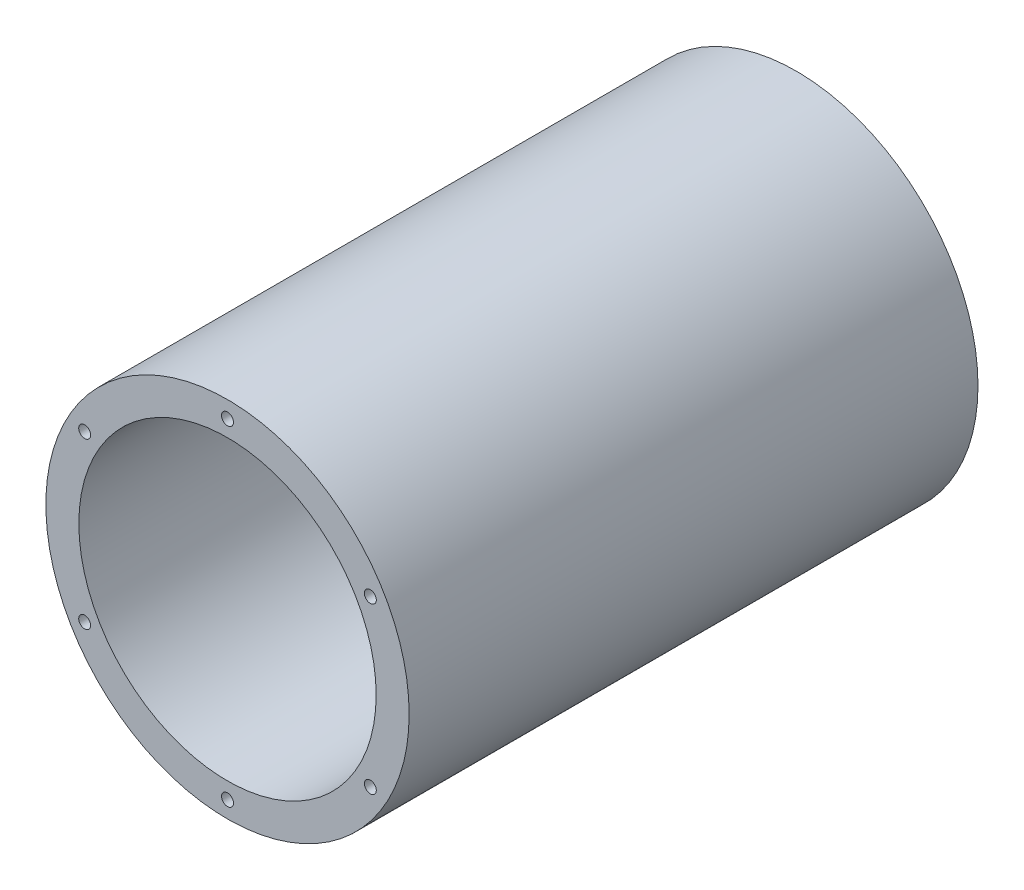
ISO-10303-21;
HEADER;
FILE_DESCRIPTION(('STEP AP214'),'2;1');
FILE_NAME('part.step','',(''),(''),'','','');
FILE_SCHEMA(('AUTOMOTIVE_DESIGN { 1 0 10303 214 1 1 1 1 }'));
ENDSEC;
DATA;
#1=APPLICATION_CONTEXT('core data for automotive mechanical design processes');
#2=APPLICATION_PROTOCOL_DEFINITION('international standard','automotive_design',2000,#1);
#3=PRODUCT_CONTEXT('',#1,'mechanical');
#4=PRODUCT('Part','Part','',(#3));
#5=PRODUCT_RELATED_PRODUCT_CATEGORY('part','',(#4));
#6=PRODUCT_DEFINITION_FORMATION('','',#4);
#7=PRODUCT_DEFINITION_CONTEXT('part definition',#1,'design');
#8=PRODUCT_DEFINITION('design','',#6,#7);
#9=PRODUCT_DEFINITION_SHAPE('','',#8);
#10=(LENGTH_UNIT() NAMED_UNIT(*) SI_UNIT(.MILLI.,.METRE.));
#11=(NAMED_UNIT(*) PLANE_ANGLE_UNIT() SI_UNIT($,.RADIAN.));
#12=(NAMED_UNIT(*) SI_UNIT($,.STERADIAN.) SOLID_ANGLE_UNIT());
#13=UNCERTAINTY_MEASURE_WITH_UNIT(LENGTH_MEASURE(1.E-05),#10,'distance_accuracy_value','');
#14=(GEOMETRIC_REPRESENTATION_CONTEXT(3) GLOBAL_UNCERTAINTY_ASSIGNED_CONTEXT((#13)) GLOBAL_UNIT_ASSIGNED_CONTEXT((#10,
#11,#12)) REPRESENTATION_CONTEXT('',''));
#15=CARTESIAN_POINT('',(0.,0.,0.));
#16=DIRECTION('',(0.,0.,1.));
#17=DIRECTION('',(1.,0.,0.));
#18=AXIS2_PLACEMENT_3D('',#15,#16,#17);
#19=CARTESIAN_POINT('',(0.,0.,-59.5));
#20=DIRECTION('',(0.,0.,1.));
#21=DIRECTION('',(1.,0.,0.));
#22=AXIS2_PLACEMENT_3D('',#19,#20,#21);
#23=PLANE('',#22);
#24=CARTESIAN_POINT('',(0.,34.5,-59.5));
#25=DIRECTION('',(0.,0.,-1.));
#26=DIRECTION('',(-1.,0.,0.));
#27=AXIS2_PLACEMENT_3D('',#24,#25,#26);
#28=CIRCLE('',#27,1.24999999999999);
#29=CARTESIAN_POINT('',(-1.24999999999999,34.5,-59.5));
#30=VERTEX_POINT('',#29);
#31=EDGE_CURVE('E106',#30,#30,#28,.T.);
#32=ORIENTED_EDGE('',*,*,#31,.F.);
#33=EDGE_LOOP('',(#32));
#34=FACE_BOUND('',#33,.T.);
#35=CARTESIAN_POINT('',(0.,0.,-59.5));
#36=DIRECTION('',(0.,0.,1.));
#37=DIRECTION('',(1.,0.,0.));
#38=AXIS2_PLACEMENT_3D('',#35,#36,#37);
#39=CIRCLE('',#38,31.1);
#40=CARTESIAN_POINT('',(31.1,0.,-59.5));
#41=VERTEX_POINT('',#40);
#42=EDGE_CURVE('E176',#41,#41,#39,.T.);
#43=ORIENTED_EDGE('',*,*,#42,.T.);
#44=EDGE_LOOP('',(#43));
#45=FACE_BOUND('',#44,.T.);
#46=CARTESIAN_POINT('',(0.,0.,-59.5));
#47=DIRECTION('',(0.,0.,1.));
#48=DIRECTION('',(1.,0.,0.));
#49=AXIS2_PLACEMENT_3D('',#46,#47,#48);
#50=CIRCLE('',#49,38.);
#51=CARTESIAN_POINT('',(38.,0.,-59.5));
#52=VERTEX_POINT('',#51);
#53=EDGE_CURVE('E54',#52,#52,#50,.T.);
#54=ORIENTED_EDGE('',*,*,#53,.F.);
#55=EDGE_LOOP('',(#54));
#56=FACE_BOUND('',#55,.T.);
#57=CARTESIAN_POINT('',(-29.8778764305622,17.2499999999983,-59.5));
#58=DIRECTION('',(0.,0.,-1.));
#59=DIRECTION('',(-1.,0.,0.));
#60=AXIS2_PLACEMENT_3D('',#57,#58,#59);
#61=CIRCLE('',#60,1.24999999999999);
#62=CARTESIAN_POINT('',(-31.1278764305621,17.2499999999983,-59.5));
#63=VERTEX_POINT('',#62);
#64=EDGE_CURVE('E134',#63,#63,#61,.T.);
#65=ORIENTED_EDGE('',*,*,#64,.F.);
#66=EDGE_LOOP('',(#65));
#67=FACE_BOUND('',#66,.T.);
#68=CARTESIAN_POINT('',(-29.8778764305602,-17.2500000000017,-59.5));
#69=DIRECTION('',(0.,0.,-1.));
#70=DIRECTION('',(-1.,0.,0.));
#71=AXIS2_PLACEMENT_3D('',#68,#69,#70);
#72=CIRCLE('',#71,1.24999999999999);
#73=CARTESIAN_POINT('',(-31.1278764305602,-17.2500000000017,-59.5));
#74=VERTEX_POINT('',#73);
#75=EDGE_CURVE('E128',#74,#74,#72,.T.);
#76=ORIENTED_EDGE('',*,*,#75,.F.);
#77=EDGE_LOOP('',(#76));
#78=FACE_BOUND('',#77,.T.);
#79=CARTESIAN_POINT('',(3.91374583848164E-12,-34.5,-59.5));
#80=DIRECTION('',(0.,0.,-1.));
#81=DIRECTION('',(-1.,0.,0.));
#82=AXIS2_PLACEMENT_3D('',#79,#80,#81);
#83=CIRCLE('',#82,1.24999999999999);
#84=CARTESIAN_POINT('',(-1.24999999999608,-34.5,-59.5));
#85=VERTEX_POINT('',#84);
#86=EDGE_CURVE('E122',#85,#85,#83,.T.);
#87=ORIENTED_EDGE('',*,*,#86,.F.);
#88=EDGE_LOOP('',(#87));
#89=FACE_BOUND('',#88,.T.);
#90=CARTESIAN_POINT('',(29.8778764305661,-17.2499999999983,-59.5));
#91=DIRECTION('',(0.,0.,-1.));
#92=DIRECTION('',(-1.,0.,0.));
#93=AXIS2_PLACEMENT_3D('',#90,#91,#92);
#94=CIRCLE('',#93,1.24999999999999);
#95=CARTESIAN_POINT('',(28.6278764305661,-17.2499999999983,-59.5));
#96=VERTEX_POINT('',#95);
#97=EDGE_CURVE('E116',#96,#96,#94,.T.);
#98=ORIENTED_EDGE('',*,*,#97,.F.);
#99=EDGE_LOOP('',(#98));
#100=FACE_BOUND('',#99,.T.);
#101=CARTESIAN_POINT('',(29.8778764305641,17.2500000000017,-59.5));
#102=DIRECTION('',(0.,0.,-1.));
#103=DIRECTION('',(-1.,0.,0.));
#104=AXIS2_PLACEMENT_3D('',#101,#102,#103);
#105=CIRCLE('',#104,1.24999999999999);
#106=CARTESIAN_POINT('',(28.6278764305641,17.2500000000017,-59.5));
#107=VERTEX_POINT('',#106);
#108=EDGE_CURVE('E105',#107,#107,#105,.T.);
#109=ORIENTED_EDGE('',*,*,#108,.F.);
#110=EDGE_LOOP('',(#109));
#111=FACE_BOUND('',#110,.T.);
#112=ADVANCED_FACE('F50',(#34,#45,#56,#67,#78,#89,#100,#111),#23,.F.);
#113=CARTESIAN_POINT('',(0.,0.,59.5));
#114=DIRECTION('',(0.,0.,1.));
#115=DIRECTION('',(1.,0.,0.));
#116=AXIS2_PLACEMENT_3D('',#113,#114,#115);
#117=PLANE('',#116);
#118=CARTESIAN_POINT('',(0.,34.5,59.5));
#119=DIRECTION('',(0.,0.,1.));
#120=DIRECTION('',(1.,0.,0.));
#121=AXIS2_PLACEMENT_3D('',#118,#119,#120);
#122=CIRCLE('',#121,1.24999999999999);
#123=CARTESIAN_POINT('',(1.24999999999999,34.5,59.5));
#124=VERTEX_POINT('',#123);
#125=EDGE_CURVE('E140',#124,#124,#122,.T.);
#126=ORIENTED_EDGE('',*,*,#125,.F.);
#127=EDGE_LOOP('',(#126));
#128=FACE_BOUND('',#127,.T.);
#129=CARTESIAN_POINT('',(29.8778764305641,17.2500000000017,59.5));
#130=DIRECTION('',(0.,0.,1.));
#131=DIRECTION('',(1.,0.,0.));
#132=AXIS2_PLACEMENT_3D('',#129,#130,#131);
#133=CIRCLE('',#132,1.24999999999999);
#134=CARTESIAN_POINT('',(31.1278764305641,17.2500000000017,59.5));
#135=VERTEX_POINT('',#134);
#136=EDGE_CURVE('E146',#135,#135,#133,.T.);
#137=ORIENTED_EDGE('',*,*,#136,.F.);
#138=EDGE_LOOP('',(#137));
#139=FACE_BOUND('',#138,.T.);
#140=CARTESIAN_POINT('',(29.8778764305661,-17.2499999999983,59.5));
#141=DIRECTION('',(0.,0.,1.));
#142=DIRECTION('',(1.,0.,0.));
#143=AXIS2_PLACEMENT_3D('',#140,#141,#142);
#144=CIRCLE('',#143,1.24999999999999);
#145=CARTESIAN_POINT('',(31.1278764305661,-17.2499999999983,59.5));
#146=VERTEX_POINT('',#145);
#147=EDGE_CURVE('E152',#146,#146,#144,.T.);
#148=ORIENTED_EDGE('',*,*,#147,.F.);
#149=EDGE_LOOP('',(#148));
#150=FACE_BOUND('',#149,.T.);
#151=CARTESIAN_POINT('',(3.91374583848164E-12,-34.5,59.5));
#152=DIRECTION('',(0.,0.,1.));
#153=DIRECTION('',(1.,0.,0.));
#154=AXIS2_PLACEMENT_3D('',#151,#152,#153);
#155=CIRCLE('',#154,1.24999999999999);
#156=CARTESIAN_POINT('',(1.2500000000039,-34.5,59.5));
#157=VERTEX_POINT('',#156);
#158=EDGE_CURVE('E158',#157,#157,#155,.T.);
#159=ORIENTED_EDGE('',*,*,#158,.F.);
#160=EDGE_LOOP('',(#159));
#161=FACE_BOUND('',#160,.T.);
#162=CARTESIAN_POINT('',(-29.8778764305602,-17.2500000000017,59.5));
#163=DIRECTION('',(0.,0.,1.));
#164=DIRECTION('',(1.,0.,0.));
#165=AXIS2_PLACEMENT_3D('',#162,#163,#164);
#166=CIRCLE('',#165,1.24999999999999);
#167=CARTESIAN_POINT('',(-28.6278764305602,-17.2500000000017,59.5));
#168=VERTEX_POINT('',#167);
#169=EDGE_CURVE('E164',#168,#168,#166,.T.);
#170=ORIENTED_EDGE('',*,*,#169,.F.);
#171=EDGE_LOOP('',(#170));
#172=FACE_BOUND('',#171,.T.);
#173=CARTESIAN_POINT('',(-29.8778764305622,17.2499999999983,59.5));
#174=DIRECTION('',(0.,0.,1.));
#175=DIRECTION('',(1.,0.,0.));
#176=AXIS2_PLACEMENT_3D('',#173,#174,#175);
#177=CIRCLE('',#176,1.24999999999999);
#178=CARTESIAN_POINT('',(-28.6278764305622,17.2499999999983,59.5));
#179=VERTEX_POINT('',#178);
#180=EDGE_CURVE('E170',#179,#179,#177,.T.);
#181=ORIENTED_EDGE('',*,*,#180,.F.);
#182=EDGE_LOOP('',(#181));
#183=FACE_BOUND('',#182,.T.);
#184=CARTESIAN_POINT('',(0.,0.,59.5));
#185=DIRECTION('',(0.,0.,1.));
#186=DIRECTION('',(1.,0.,0.));
#187=AXIS2_PLACEMENT_3D('',#184,#185,#186);
#188=CIRCLE('',#187,38.);
#189=CARTESIAN_POINT('',(38.,0.,59.5));
#190=VERTEX_POINT('',#189);
#191=EDGE_CURVE('E13',#190,#190,#188,.T.);
#192=ORIENTED_EDGE('',*,*,#191,.T.);
#193=EDGE_LOOP('',(#192));
#194=FACE_BOUND('',#193,.T.);
#195=CARTESIAN_POINT('',(0.,0.,59.5));
#196=DIRECTION('',(0.,0.,1.));
#197=DIRECTION('',(1.,0.,0.));
#198=AXIS2_PLACEMENT_3D('',#195,#196,#197);
#199=CIRCLE('',#198,31.1);
#200=CARTESIAN_POINT('',(31.1,0.,59.5));
#201=VERTEX_POINT('',#200);
#202=EDGE_CURVE('E177',#201,#201,#199,.T.);
#203=ORIENTED_EDGE('',*,*,#202,.F.);
#204=EDGE_LOOP('',(#203));
#205=FACE_BOUND('',#204,.T.);
#206=ADVANCED_FACE('F196',(#128,#139,#150,#161,#172,#183,#194,#205),#117,.T.);
#207=CARTESIAN_POINT('',(0.,0.,59.5));
#208=DIRECTION('',(0.,0.,-1.));
#209=DIRECTION('',(-1.,0.,0.));
#210=AXIS2_PLACEMENT_3D('',#207,#208,#209);
#211=CYLINDRICAL_SURFACE('',#210,38.);
#212=ORIENTED_EDGE('',*,*,#191,.F.);
#213=EDGE_LOOP('',(#212));
#214=FACE_BOUND('',#213,.T.);
#215=ORIENTED_EDGE('',*,*,#53,.T.);
#216=EDGE_LOOP('',(#215));
#217=FACE_BOUND('',#216,.T.);
#218=ADVANCED_FACE('F52',(#214,#217),#211,.T.);
#219=CARTESIAN_POINT('',(0.,0.,59.5));
#220=DIRECTION('',(0.,0.,-1.));
#221=DIRECTION('',(-1.,0.,0.));
#222=AXIS2_PLACEMENT_3D('',#219,#220,#221);
#223=CYLINDRICAL_SURFACE('',#222,31.1);
#224=ORIENTED_EDGE('',*,*,#202,.T.);
#225=EDGE_LOOP('',(#224));
#226=FACE_BOUND('',#225,.T.);
#227=ORIENTED_EDGE('',*,*,#42,.F.);
#228=EDGE_LOOP('',(#227));
#229=FACE_BOUND('',#228,.T.);
#230=ADVANCED_FACE('F185',(#226,#229),#223,.F.);
#231=CARTESIAN_POINT('',(-29.8778764305622,17.2499999999983,51.));
#232=DIRECTION('',(0.,0.,1.));
#233=DIRECTION('',(1.,0.,0.));
#234=AXIS2_PLACEMENT_3D('',#231,#232,#233);
#235=CONICAL_SURFACE('',#234,1.24999999999999,1.02974425867665);
#236=CARTESIAN_POINT('',(-29.8778764305622,17.2499999999983,50.2489242262155));
#237=VERTEX_POINT('',#236);
#238=VERTEX_LOOP('',#237);
#239=FACE_BOUND('',#238,.T.);
#240=CARTESIAN_POINT('',(-29.8778764305622,17.2499999999983,51.));
#241=DIRECTION('',(0.,0.,1.));
#242=DIRECTION('',(1.,0.,0.));
#243=AXIS2_PLACEMENT_3D('',#240,#241,#242);
#244=CIRCLE('',#243,1.24999999999999);
#245=CARTESIAN_POINT('',(-28.6278764305622,17.2499999999983,51.));
#246=VERTEX_POINT('',#245);
#247=EDGE_CURVE('E173',#246,#246,#244,.T.);
#248=ORIENTED_EDGE('',*,*,#247,.T.);
#249=EDGE_LOOP('',(#248));
#250=FACE_BOUND('',#249,.T.);
#251=ADVANCED_FACE('F187',(#239,#250),#235,.F.);
#252=CARTESIAN_POINT('',(-29.8778764305622,17.2499999999983,59.5));
#253=DIRECTION('',(0.,0.,1.));
#254=DIRECTION('',(1.,0.,0.));
#255=AXIS2_PLACEMENT_3D('',#252,#253,#254);
#256=CYLINDRICAL_SURFACE('',#255,1.24999999999999);
#257=ORIENTED_EDGE('',*,*,#247,.F.);
#258=EDGE_LOOP('',(#257));
#259=FACE_BOUND('',#258,.T.);
#260=ORIENTED_EDGE('',*,*,#180,.T.);
#261=EDGE_LOOP('',(#260));
#262=FACE_BOUND('',#261,.T.);
#263=ADVANCED_FACE('F194',(#259,#262),#256,.F.);
#264=CARTESIAN_POINT('',(-29.8778764305602,-17.2500000000017,51.));
#265=DIRECTION('',(0.,0.,1.));
#266=DIRECTION('',(1.,0.,0.));
#267=AXIS2_PLACEMENT_3D('',#264,#265,#266);
#268=CONICAL_SURFACE('',#267,1.24999999999999,1.02974425867665);
#269=CARTESIAN_POINT('',(-29.8778764305602,-17.2500000000017,50.2489242262155));
#270=VERTEX_POINT('',#269);
#271=VERTEX_LOOP('',#270);
#272=FACE_BOUND('',#271,.T.);
#273=CARTESIAN_POINT('',(-29.8778764305602,-17.2500000000017,51.));
#274=DIRECTION('',(0.,0.,1.));
#275=DIRECTION('',(1.,0.,0.));
#276=AXIS2_PLACEMENT_3D('',#273,#274,#275);
#277=CIRCLE('',#276,1.24999999999999);
#278=CARTESIAN_POINT('',(-28.6278764305602,-17.2500000000017,51.));
#279=VERTEX_POINT('',#278);
#280=EDGE_CURVE('E167',#279,#279,#277,.T.);
#281=ORIENTED_EDGE('',*,*,#280,.T.);
#282=EDGE_LOOP('',(#281));
#283=FACE_BOUND('',#282,.T.);
#284=ADVANCED_FACE('F286',(#272,#283),#268,.F.);
#285=CARTESIAN_POINT('',(-29.8778764305602,-17.2500000000017,59.5));
#286=DIRECTION('',(0.,0.,1.));
#287=DIRECTION('',(1.,0.,0.));
#288=AXIS2_PLACEMENT_3D('',#285,#286,#287);
#289=CYLINDRICAL_SURFACE('',#288,1.24999999999999);
#290=ORIENTED_EDGE('',*,*,#280,.F.);
#291=EDGE_LOOP('',(#290));
#292=FACE_BOUND('',#291,.T.);
#293=ORIENTED_EDGE('',*,*,#169,.T.);
#294=EDGE_LOOP('',(#293));
#295=FACE_BOUND('',#294,.T.);
#296=ADVANCED_FACE('F282',(#292,#295),#289,.F.);
#297=CARTESIAN_POINT('',(3.91374583848164E-12,-34.5,51.));
#298=DIRECTION('',(0.,0.,1.));
#299=DIRECTION('',(1.,0.,0.));
#300=AXIS2_PLACEMENT_3D('',#297,#298,#299);
#301=CONICAL_SURFACE('',#300,1.24999999999999,1.02974425867665);
#302=CARTESIAN_POINT('',(3.91147997841463E-12,-34.5,50.2489242262155));
#303=VERTEX_POINT('',#302);
#304=VERTEX_LOOP('',#303);
#305=FACE_BOUND('',#304,.T.);
#306=CARTESIAN_POINT('',(3.91374583848164E-12,-34.5,51.));
#307=DIRECTION('',(0.,0.,1.));
#308=DIRECTION('',(1.,0.,0.));
#309=AXIS2_PLACEMENT_3D('',#306,#307,#308);
#310=CIRCLE('',#309,1.24999999999999);
#311=CARTESIAN_POINT('',(1.2500000000039,-34.5,51.));
#312=VERTEX_POINT('',#311);
#313=EDGE_CURVE('E161',#312,#312,#310,.T.);
#314=ORIENTED_EDGE('',*,*,#313,.T.);
#315=EDGE_LOOP('',(#314));
#316=FACE_BOUND('',#315,.T.);
#317=ADVANCED_FACE('F278',(#305,#316),#301,.F.);
#318=CARTESIAN_POINT('',(3.91374583848164E-12,-34.5,59.5));
#319=DIRECTION('',(0.,0.,1.));
#320=DIRECTION('',(1.,0.,0.));
#321=AXIS2_PLACEMENT_3D('',#318,#319,#320);
#322=CYLINDRICAL_SURFACE('',#321,1.24999999999999);
#323=ORIENTED_EDGE('',*,*,#313,.F.);
#324=EDGE_LOOP('',(#323));
#325=FACE_BOUND('',#324,.T.);
#326=ORIENTED_EDGE('',*,*,#158,.T.);
#327=EDGE_LOOP('',(#326));
#328=FACE_BOUND('',#327,.T.);
#329=ADVANCED_FACE('F274',(#325,#328),#322,.F.);
#330=CARTESIAN_POINT('',(29.8778764305661,-17.2499999999983,51.));
#331=DIRECTION('',(0.,0.,1.));
#332=DIRECTION('',(1.,0.,0.));
#333=AXIS2_PLACEMENT_3D('',#330,#331,#332);
#334=CONICAL_SURFACE('',#333,1.24999999999999,1.02974425867665);
#335=CARTESIAN_POINT('',(29.8778764305661,-17.2499999999983,50.2489242262155));
#336=VERTEX_POINT('',#335);
#337=VERTEX_LOOP('',#336);
#338=FACE_BOUND('',#337,.T.);
#339=CARTESIAN_POINT('',(29.8778764305661,-17.2499999999983,51.));
#340=DIRECTION('',(0.,0.,1.));
#341=DIRECTION('',(1.,0.,0.));
#342=AXIS2_PLACEMENT_3D('',#339,#340,#341);
#343=CIRCLE('',#342,1.24999999999999);
#344=CARTESIAN_POINT('',(31.1278764305661,-17.2499999999983,51.));
#345=VERTEX_POINT('',#344);
#346=EDGE_CURVE('E155',#345,#345,#343,.T.);
#347=ORIENTED_EDGE('',*,*,#346,.T.);
#348=EDGE_LOOP('',(#347));
#349=FACE_BOUND('',#348,.T.);
#350=ADVANCED_FACE('F270',(#338,#349),#334,.F.);
#351=CARTESIAN_POINT('',(29.8778764305661,-17.2499999999983,59.5));
#352=DIRECTION('',(0.,0.,1.));
#353=DIRECTION('',(1.,0.,0.));
#354=AXIS2_PLACEMENT_3D('',#351,#352,#353);
#355=CYLINDRICAL_SURFACE('',#354,1.24999999999999);
#356=ORIENTED_EDGE('',*,*,#346,.F.);
#357=EDGE_LOOP('',(#356));
#358=FACE_BOUND('',#357,.T.);
#359=ORIENTED_EDGE('',*,*,#147,.T.);
#360=EDGE_LOOP('',(#359));
#361=FACE_BOUND('',#360,.T.);
#362=ADVANCED_FACE('F266',(#358,#361),#355,.F.);
#363=CARTESIAN_POINT('',(29.8778764305641,17.2500000000017,51.));
#364=DIRECTION('',(0.,0.,1.));
#365=DIRECTION('',(1.,0.,0.));
#366=AXIS2_PLACEMENT_3D('',#363,#364,#365);
#367=CONICAL_SURFACE('',#366,1.24999999999999,1.02974425867665);
#368=CARTESIAN_POINT('',(29.8778764305641,17.2500000000017,50.2489242262155));
#369=VERTEX_POINT('',#368);
#370=VERTEX_LOOP('',#369);
#371=FACE_BOUND('',#370,.T.);
#372=CARTESIAN_POINT('',(29.8778764305641,17.2500000000017,51.));
#373=DIRECTION('',(0.,0.,1.));
#374=DIRECTION('',(1.,0.,0.));
#375=AXIS2_PLACEMENT_3D('',#372,#373,#374);
#376=CIRCLE('',#375,1.24999999999999);
#377=CARTESIAN_POINT('',(31.1278764305641,17.2500000000017,51.));
#378=VERTEX_POINT('',#377);
#379=EDGE_CURVE('E149',#378,#378,#376,.T.);
#380=ORIENTED_EDGE('',*,*,#379,.T.);
#381=EDGE_LOOP('',(#380));
#382=FACE_BOUND('',#381,.T.);
#383=ADVANCED_FACE('F262',(#371,#382),#367,.F.);
#384=CARTESIAN_POINT('',(29.8778764305641,17.2500000000017,59.5));
#385=DIRECTION('',(0.,0.,1.));
#386=DIRECTION('',(1.,0.,0.));
#387=AXIS2_PLACEMENT_3D('',#384,#385,#386);
#388=CYLINDRICAL_SURFACE('',#387,1.24999999999999);
#389=ORIENTED_EDGE('',*,*,#379,.F.);
#390=EDGE_LOOP('',(#389));
#391=FACE_BOUND('',#390,.T.);
#392=ORIENTED_EDGE('',*,*,#136,.T.);
#393=EDGE_LOOP('',(#392));
#394=FACE_BOUND('',#393,.T.);
#395=ADVANCED_FACE('F258',(#391,#394),#388,.F.);
#396=CARTESIAN_POINT('',(0.,34.5,51.));
#397=DIRECTION('',(0.,0.,1.));
#398=DIRECTION('',(1.,0.,0.));
#399=AXIS2_PLACEMENT_3D('',#396,#397,#398);
#400=CONICAL_SURFACE('',#399,1.24999999999999,1.02974425867665);
#401=CARTESIAN_POINT('',(0.,34.5,50.2489242262155));
#402=VERTEX_POINT('',#401);
#403=VERTEX_LOOP('',#402);
#404=FACE_BOUND('',#403,.T.);
#405=CARTESIAN_POINT('',(0.,34.5,51.));
#406=DIRECTION('',(0.,0.,1.));
#407=DIRECTION('',(1.,0.,0.));
#408=AXIS2_PLACEMENT_3D('',#405,#406,#407);
#409=CIRCLE('',#408,1.24999999999999);
#410=CARTESIAN_POINT('',(1.24999999999999,34.5,51.));
#411=VERTEX_POINT('',#410);
#412=EDGE_CURVE('E143',#411,#411,#409,.T.);
#413=ORIENTED_EDGE('',*,*,#412,.T.);
#414=EDGE_LOOP('',(#413));
#415=FACE_BOUND('',#414,.T.);
#416=ADVANCED_FACE('F254',(#404,#415),#400,.F.);
#417=CARTESIAN_POINT('',(0.,34.5,59.5));
#418=DIRECTION('',(0.,0.,1.));
#419=DIRECTION('',(1.,0.,0.));
#420=AXIS2_PLACEMENT_3D('',#417,#418,#419);
#421=CYLINDRICAL_SURFACE('',#420,1.24999999999999);
#422=ORIENTED_EDGE('',*,*,#412,.F.);
#423=EDGE_LOOP('',(#422));
#424=FACE_BOUND('',#423,.T.);
#425=ORIENTED_EDGE('',*,*,#125,.T.);
#426=EDGE_LOOP('',(#425));
#427=FACE_BOUND('',#426,.T.);
#428=ADVANCED_FACE('F250',(#424,#427),#421,.F.);
#429=CARTESIAN_POINT('',(-29.8778764305622,17.2499999999983,-51.));
#430=DIRECTION('',(0.,0.,-1.));
#431=DIRECTION('',(-1.,0.,0.));
#432=AXIS2_PLACEMENT_3D('',#429,#430,#431);
#433=CONICAL_SURFACE('',#432,1.24999999999999,1.02974425867665);
#434=CARTESIAN_POINT('',(-29.8778764305622,17.2499999999983,-50.2489242262155));
#435=VERTEX_POINT('',#434);
#436=VERTEX_LOOP('',#435);
#437=FACE_BOUND('',#436,.T.);
#438=CARTESIAN_POINT('',(-29.8778764305622,17.2499999999983,-51.));
#439=DIRECTION('',(0.,0.,-1.));
#440=DIRECTION('',(-1.,0.,0.));
#441=AXIS2_PLACEMENT_3D('',#438,#439,#440);
#442=CIRCLE('',#441,1.24999999999999);
#443=CARTESIAN_POINT('',(-31.1278764305621,17.2499999999983,-51.));
#444=VERTEX_POINT('',#443);
#445=EDGE_CURVE('E137',#444,#444,#442,.T.);
#446=ORIENTED_EDGE('',*,*,#445,.T.);
#447=EDGE_LOOP('',(#446));
#448=FACE_BOUND('',#447,.T.);
#449=ADVANCED_FACE('F246',(#437,#448),#433,.F.);
#450=CARTESIAN_POINT('',(-29.8778764305622,17.2499999999983,-59.5));
#451=DIRECTION('',(0.,0.,-1.));
#452=DIRECTION('',(-1.,0.,0.));
#453=AXIS2_PLACEMENT_3D('',#450,#451,#452);
#454=CYLINDRICAL_SURFACE('',#453,1.24999999999999);
#455=ORIENTED_EDGE('',*,*,#445,.F.);
#456=EDGE_LOOP('',(#455));
#457=FACE_BOUND('',#456,.T.);
#458=ORIENTED_EDGE('',*,*,#64,.T.);
#459=EDGE_LOOP('',(#458));
#460=FACE_BOUND('',#459,.T.);
#461=ADVANCED_FACE('F242',(#457,#460),#454,.F.);
#462=CARTESIAN_POINT('',(-29.8778764305602,-17.2500000000017,-51.));
#463=DIRECTION('',(0.,0.,-1.));
#464=DIRECTION('',(-1.,0.,0.));
#465=AXIS2_PLACEMENT_3D('',#462,#463,#464);
#466=CONICAL_SURFACE('',#465,1.24999999999999,1.02974425867665);
#467=CARTESIAN_POINT('',(-29.8778764305602,-17.2500000000017,-50.2489242262155));
#468=VERTEX_POINT('',#467);
#469=VERTEX_LOOP('',#468);
#470=FACE_BOUND('',#469,.T.);
#471=CARTESIAN_POINT('',(-29.8778764305602,-17.2500000000017,-51.));
#472=DIRECTION('',(0.,0.,-1.));
#473=DIRECTION('',(-1.,0.,0.));
#474=AXIS2_PLACEMENT_3D('',#471,#472,#473);
#475=CIRCLE('',#474,1.24999999999999);
#476=CARTESIAN_POINT('',(-31.1278764305602,-17.2500000000017,-51.));
#477=VERTEX_POINT('',#476);
#478=EDGE_CURVE('E131',#477,#477,#475,.T.);
#479=ORIENTED_EDGE('',*,*,#478,.T.);
#480=EDGE_LOOP('',(#479));
#481=FACE_BOUND('',#480,.T.);
#482=ADVANCED_FACE('F238',(#470,#481),#466,.F.);
#483=CARTESIAN_POINT('',(-29.8778764305602,-17.2500000000017,-59.5));
#484=DIRECTION('',(0.,0.,-1.));
#485=DIRECTION('',(-1.,0.,0.));
#486=AXIS2_PLACEMENT_3D('',#483,#484,#485);
#487=CYLINDRICAL_SURFACE('',#486,1.24999999999999);
#488=ORIENTED_EDGE('',*,*,#478,.F.);
#489=EDGE_LOOP('',(#488));
#490=FACE_BOUND('',#489,.T.);
#491=ORIENTED_EDGE('',*,*,#75,.T.);
#492=EDGE_LOOP('',(#491));
#493=FACE_BOUND('',#492,.T.);
#494=ADVANCED_FACE('F234',(#490,#493),#487,.F.);
#495=CARTESIAN_POINT('',(3.91374583848164E-12,-34.5,-51.));
#496=DIRECTION('',(0.,0.,-1.));
#497=DIRECTION('',(-1.,0.,0.));
#498=AXIS2_PLACEMENT_3D('',#495,#496,#497);
#499=CONICAL_SURFACE('',#498,1.24999999999999,1.02974425867665);
#500=CARTESIAN_POINT('',(3.91147997841463E-12,-34.5,-50.2489242262155));
#501=VERTEX_POINT('',#500);
#502=VERTEX_LOOP('',#501);
#503=FACE_BOUND('',#502,.T.);
#504=CARTESIAN_POINT('',(3.91374583848164E-12,-34.5,-51.));
#505=DIRECTION('',(0.,0.,-1.));
#506=DIRECTION('',(-1.,0.,0.));
#507=AXIS2_PLACEMENT_3D('',#504,#505,#506);
#508=CIRCLE('',#507,1.24999999999999);
#509=CARTESIAN_POINT('',(-1.24999999999607,-34.5,-51.));
#510=VERTEX_POINT('',#509);
#511=EDGE_CURVE('E125',#510,#510,#508,.T.);
#512=ORIENTED_EDGE('',*,*,#511,.T.);
#513=EDGE_LOOP('',(#512));
#514=FACE_BOUND('',#513,.T.);
#515=ADVANCED_FACE('F230',(#503,#514),#499,.F.);
#516=CARTESIAN_POINT('',(3.91374583848164E-12,-34.5,-59.5));
#517=DIRECTION('',(0.,0.,-1.));
#518=DIRECTION('',(-1.,0.,0.));
#519=AXIS2_PLACEMENT_3D('',#516,#517,#518);
#520=CYLINDRICAL_SURFACE('',#519,1.24999999999999);
#521=ORIENTED_EDGE('',*,*,#511,.F.);
#522=EDGE_LOOP('',(#521));
#523=FACE_BOUND('',#522,.T.);
#524=ORIENTED_EDGE('',*,*,#86,.T.);
#525=EDGE_LOOP('',(#524));
#526=FACE_BOUND('',#525,.T.);
#527=ADVANCED_FACE('F226',(#523,#526),#520,.F.);
#528=CARTESIAN_POINT('',(29.8778764305661,-17.2499999999983,-51.));
#529=DIRECTION('',(0.,0.,-1.));
#530=DIRECTION('',(-1.,0.,0.));
#531=AXIS2_PLACEMENT_3D('',#528,#529,#530);
#532=CONICAL_SURFACE('',#531,1.24999999999999,1.02974425867665);
#533=CARTESIAN_POINT('',(29.8778764305661,-17.2499999999983,-50.2489242262155));
#534=VERTEX_POINT('',#533);
#535=VERTEX_LOOP('',#534);
#536=FACE_BOUND('',#535,.T.);
#537=CARTESIAN_POINT('',(29.8778764305661,-17.2499999999983,-51.));
#538=DIRECTION('',(0.,0.,-1.));
#539=DIRECTION('',(-1.,0.,0.));
#540=AXIS2_PLACEMENT_3D('',#537,#538,#539);
#541=CIRCLE('',#540,1.24999999999999);
#542=CARTESIAN_POINT('',(28.6278764305661,-17.2499999999983,-51.));
#543=VERTEX_POINT('',#542);
#544=EDGE_CURVE('E119',#543,#543,#541,.T.);
#545=ORIENTED_EDGE('',*,*,#544,.T.);
#546=EDGE_LOOP('',(#545));
#547=FACE_BOUND('',#546,.T.);
#548=ADVANCED_FACE('F222',(#536,#547),#532,.F.);
#549=CARTESIAN_POINT('',(29.8778764305661,-17.2499999999983,-59.5));
#550=DIRECTION('',(0.,0.,-1.));
#551=DIRECTION('',(-1.,0.,0.));
#552=AXIS2_PLACEMENT_3D('',#549,#550,#551);
#553=CYLINDRICAL_SURFACE('',#552,1.24999999999999);
#554=ORIENTED_EDGE('',*,*,#544,.F.);
#555=EDGE_LOOP('',(#554));
#556=FACE_BOUND('',#555,.T.);
#557=ORIENTED_EDGE('',*,*,#97,.T.);
#558=EDGE_LOOP('',(#557));
#559=FACE_BOUND('',#558,.T.);
#560=ADVANCED_FACE('F218',(#556,#559),#553,.F.);
#561=CARTESIAN_POINT('',(29.8778764305641,17.2500000000017,-51.));
#562=DIRECTION('',(0.,0.,-1.));
#563=DIRECTION('',(-1.,0.,0.));
#564=AXIS2_PLACEMENT_3D('',#561,#562,#563);
#565=CONICAL_SURFACE('',#564,1.24999999999999,1.02974425867665);
#566=CARTESIAN_POINT('',(29.8778764305641,17.2500000000017,-50.2489242262155));
#567=VERTEX_POINT('',#566);
#568=VERTEX_LOOP('',#567);
#569=FACE_BOUND('',#568,.T.);
#570=CARTESIAN_POINT('',(29.8778764305641,17.2500000000017,-51.));
#571=DIRECTION('',(0.,0.,-1.));
#572=DIRECTION('',(-1.,0.,0.));
#573=AXIS2_PLACEMENT_3D('',#570,#571,#572);
#574=CIRCLE('',#573,1.24999999999999);
#575=CARTESIAN_POINT('',(28.6278764305641,17.2500000000017,-51.));
#576=VERTEX_POINT('',#575);
#577=EDGE_CURVE('E109',#576,#576,#574,.T.);
#578=ORIENTED_EDGE('',*,*,#577,.T.);
#579=EDGE_LOOP('',(#578));
#580=FACE_BOUND('',#579,.T.);
#581=ADVANCED_FACE('F214',(#569,#580),#565,.F.);
#582=CARTESIAN_POINT('',(29.8778764305641,17.2500000000017,-59.5));
#583=DIRECTION('',(0.,0.,-1.));
#584=DIRECTION('',(-1.,0.,0.));
#585=AXIS2_PLACEMENT_3D('',#582,#583,#584);
#586=CYLINDRICAL_SURFACE('',#585,1.24999999999999);
#587=ORIENTED_EDGE('',*,*,#577,.F.);
#588=EDGE_LOOP('',(#587));
#589=FACE_BOUND('',#588,.T.);
#590=ORIENTED_EDGE('',*,*,#108,.T.);
#591=EDGE_LOOP('',(#590));
#592=FACE_BOUND('',#591,.T.);
#593=ADVANCED_FACE('F99',(#589,#592),#586,.F.);
#594=CARTESIAN_POINT('',(0.,34.5,-51.));
#595=DIRECTION('',(0.,0.,-1.));
#596=DIRECTION('',(-1.,0.,0.));
#597=AXIS2_PLACEMENT_3D('',#594,#595,#596);
#598=CONICAL_SURFACE('',#597,1.24999999999999,1.02974425867665);
#599=CARTESIAN_POINT('',(0.,34.5,-50.2489242262155));
#600=VERTEX_POINT('',#599);
#601=VERTEX_LOOP('',#600);
#602=FACE_BOUND('',#601,.T.);
#603=CARTESIAN_POINT('',(0.,34.5,-51.));
#604=DIRECTION('',(0.,0.,-1.));
#605=DIRECTION('',(-1.,0.,0.));
#606=AXIS2_PLACEMENT_3D('',#603,#604,#605);
#607=CIRCLE('',#606,1.24999999999999);
#608=CARTESIAN_POINT('',(-1.24999999999999,34.5,-51.));
#609=VERTEX_POINT('',#608);
#610=EDGE_CURVE('E103',#609,#609,#607,.T.);
#611=ORIENTED_EDGE('',*,*,#610,.T.);
#612=EDGE_LOOP('',(#611));
#613=FACE_BOUND('',#612,.T.);
#614=ADVANCED_FACE('F95',(#602,#613),#598,.F.);
#615=CARTESIAN_POINT('',(0.,34.5,-59.5));
#616=DIRECTION('',(0.,0.,-1.));
#617=DIRECTION('',(-1.,0.,0.));
#618=AXIS2_PLACEMENT_3D('',#615,#616,#617);
#619=CYLINDRICAL_SURFACE('',#618,1.24999999999999);
#620=ORIENTED_EDGE('',*,*,#610,.F.);
#621=EDGE_LOOP('',(#620));
#622=FACE_BOUND('',#621,.T.);
#623=ORIENTED_EDGE('',*,*,#31,.T.);
#624=EDGE_LOOP('',(#623));
#625=FACE_BOUND('',#624,.T.);
#626=ADVANCED_FACE('F98',(#622,#625),#619,.F.);
#627=CLOSED_SHELL('',(#112,#206,#218,#230,#251,#263,#284,#296,#317,#329,#350,#362,#383,#395,
#416,#428,#449,#461,#482,#494,#515,#527,#548,#560,#581,#593,#614,#626));
#628=MANIFOLD_SOLID_BREP('B2',#627);
#629=ADVANCED_BREP_SHAPE_REPRESENTATION('',(#18,#628),#14);
#630=SHAPE_DEFINITION_REPRESENTATION(#9,#629);
ENDSEC;
END-ISO-10303-21;
